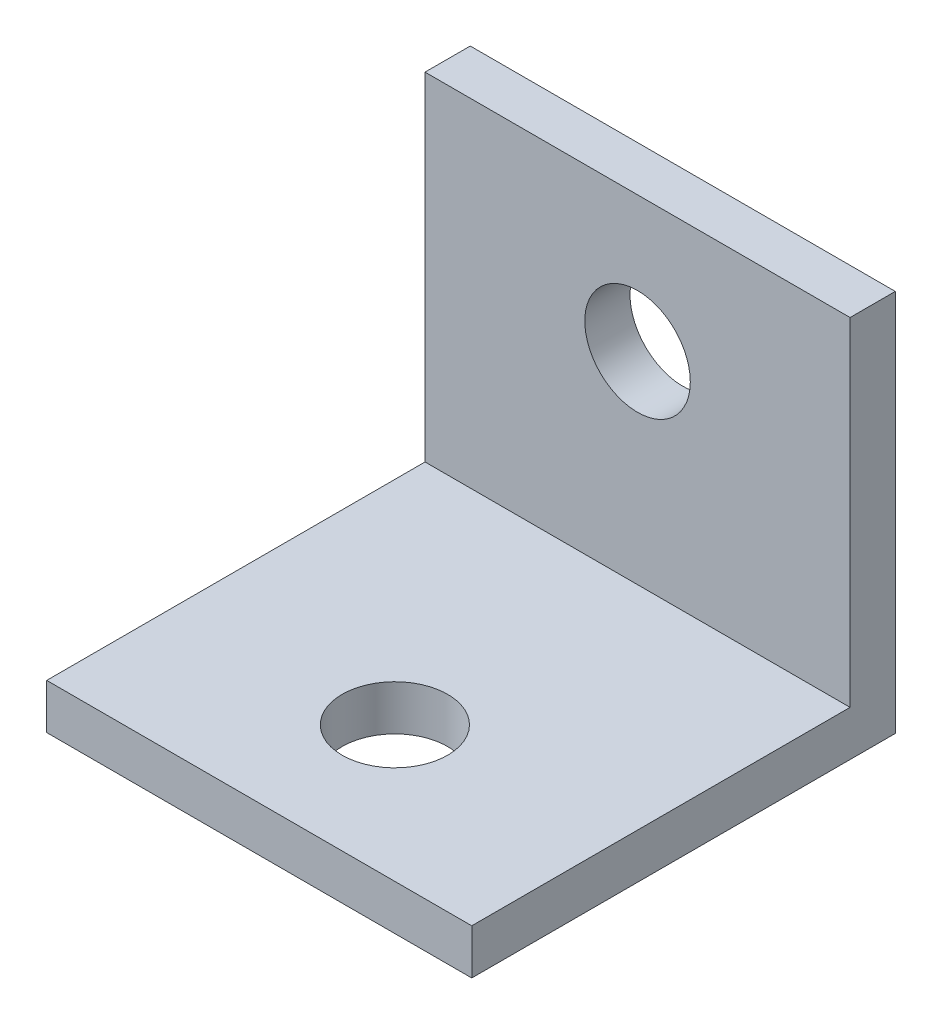
ISO-10303-21;
HEADER;
FILE_DESCRIPTION(('STEP AP214'),'2;1');
FILE_NAME('part.step','',(''),(''),'','','');
FILE_SCHEMA(('AUTOMOTIVE_DESIGN { 1 0 10303 214 1 1 1 1 }'));
ENDSEC;
DATA;
#1=APPLICATION_CONTEXT('core data for automotive mechanical design processes');
#2=APPLICATION_PROTOCOL_DEFINITION('international standard','automotive_design',2000,#1);
#3=PRODUCT_CONTEXT('',#1,'mechanical');
#4=PRODUCT('Part','Part','',(#3));
#5=PRODUCT_RELATED_PRODUCT_CATEGORY('part','',(#4));
#6=PRODUCT_DEFINITION_FORMATION('','',#4);
#7=PRODUCT_DEFINITION_CONTEXT('part definition',#1,'design');
#8=PRODUCT_DEFINITION('design','',#6,#7);
#9=PRODUCT_DEFINITION_SHAPE('','',#8);
#10=(LENGTH_UNIT() NAMED_UNIT(*) SI_UNIT(.MILLI.,.METRE.));
#11=(NAMED_UNIT(*) PLANE_ANGLE_UNIT() SI_UNIT($,.RADIAN.));
#12=(NAMED_UNIT(*) SI_UNIT($,.STERADIAN.) SOLID_ANGLE_UNIT());
#13=UNCERTAINTY_MEASURE_WITH_UNIT(LENGTH_MEASURE(1.E-05),#10,'distance_accuracy_value','');
#14=(GEOMETRIC_REPRESENTATION_CONTEXT(3) GLOBAL_UNCERTAINTY_ASSIGNED_CONTEXT((#13)) GLOBAL_UNIT_ASSIGNED_CONTEXT((#10,
#11,#12)) REPRESENTATION_CONTEXT('',''));
#15=CARTESIAN_POINT('',(0.,0.,0.));
#16=DIRECTION('',(0.,0.,1.));
#17=DIRECTION('',(1.,0.,0.));
#18=AXIS2_PLACEMENT_3D('',#15,#16,#17);
#19=CARTESIAN_POINT('',(-28.2,16.1822580645161,3.));
#20=DIRECTION('',(1.,0.,0.));
#21=DIRECTION('',(0.,1.,0.));
#22=AXIS2_PLACEMENT_3D('',#19,#20,#21);
#23=PLANE('',#22);
#24=DIRECTION('',(0.,-1.,0.));
#25=VECTOR('',#24,1.);
#26=CARTESIAN_POINT('',(-28.2,16.1822580645161,0.));
#27=LINE('',#26,#25);
#28=CARTESIAN_POINT('',(-28.2,16.1822580645161,0.));
#29=VERTEX_POINT('',#28);
#30=CARTESIAN_POINT('',(-28.2,-9.21774193548386,0.));
#31=VERTEX_POINT('',#30);
#32=EDGE_CURVE('E92',#29,#31,#27,.T.);
#33=ORIENTED_EDGE('',*,*,#32,.T.);
#34=DIRECTION('',(0.,0.,-1.));
#35=VECTOR('',#34,1.);
#36=CARTESIAN_POINT('',(-28.2,-9.21774193548386,3.));
#37=LINE('',#36,#35);
#38=CARTESIAN_POINT('',(-28.2,-9.21774193548386,28.1));
#39=VERTEX_POINT('',#38);
#40=EDGE_CURVE('E11',#39,#31,#37,.T.);
#41=ORIENTED_EDGE('',*,*,#40,.F.);
#42=DIRECTION('',(0.,-1.,0.));
#43=VECTOR('',#42,1.);
#44=CARTESIAN_POINT('',(-28.2,-9.21774193548386,28.1));
#45=LINE('',#44,#43);
#46=CARTESIAN_POINT('',(-28.2,-6.21774193548386,28.1));
#47=VERTEX_POINT('',#46);
#48=EDGE_CURVE('E129',#47,#39,#45,.T.);
#49=ORIENTED_EDGE('',*,*,#48,.F.);
#50=DIRECTION('',(0.,0.,-1.));
#51=VECTOR('',#50,1.);
#52=CARTESIAN_POINT('',(-28.2,-6.21774193548386,28.1));
#53=LINE('',#52,#51);
#54=CARTESIAN_POINT('',(-28.2,-6.21774193548386,3.));
#55=VERTEX_POINT('',#54);
#56=EDGE_CURVE('E101',#47,#55,#53,.T.);
#57=ORIENTED_EDGE('',*,*,#56,.T.);
#58=DIRECTION('',(0.,-1.,0.));
#59=VECTOR('',#58,1.);
#60=CARTESIAN_POINT('',(-28.2,16.1822580645161,3.));
#61=LINE('',#60,#59);
#62=CARTESIAN_POINT('',(-28.2,16.1822580645161,3.));
#63=VERTEX_POINT('',#62);
#64=EDGE_CURVE('E86',#63,#55,#61,.T.);
#65=ORIENTED_EDGE('',*,*,#64,.F.);
#66=DIRECTION('',(0.,0.,-1.));
#67=VECTOR('',#66,1.);
#68=CARTESIAN_POINT('',(-28.2,16.1822580645161,3.));
#69=LINE('',#68,#67);
#70=EDGE_CURVE('E79',#63,#29,#69,.T.);
#71=ORIENTED_EDGE('',*,*,#70,.T.);
#72=EDGE_LOOP('',(#33,#41,#49,#57,#65,#71));
#73=FACE_BOUND('',#72,.T.);
#74=ADVANCED_FACE('F37',(#73),#23,.F.);
#75=CARTESIAN_POINT('',(-28.2,-9.21774193548386,3.));
#76=DIRECTION('',(0.,1.,0.));
#77=DIRECTION('',(-1.,0.,0.));
#78=AXIS2_PLACEMENT_3D('',#75,#76,#77);
#79=PLANE('',#78);
#80=CARTESIAN_POINT('',(-14.1,-9.21774193548386,19.1));
#81=DIRECTION('',(0.,1.,0.));
#82=DIRECTION('',(0.,0.,1.));
#83=AXIS2_PLACEMENT_3D('',#80,#81,#82);
#84=CIRCLE('',#83,3.5);
#85=CARTESIAN_POINT('',(-14.1,-9.21774193548386,22.6));
#86=VERTEX_POINT('',#85);
#87=EDGE_CURVE('E138',#86,#86,#84,.T.);
#88=ORIENTED_EDGE('',*,*,#87,.T.);
#89=EDGE_LOOP('',(#88));
#90=FACE_BOUND('',#89,.T.);
#91=DIRECTION('',(1.,0.,0.));
#92=VECTOR('',#91,1.);
#93=CARTESIAN_POINT('',(-28.2,-9.21774193548386,0.));
#94=LINE('',#93,#92);
#95=CARTESIAN_POINT('',(0.,-9.21774193548386,0.));
#96=VERTEX_POINT('',#95);
#97=EDGE_CURVE('E96',#31,#96,#94,.T.);
#98=ORIENTED_EDGE('',*,*,#97,.T.);
#99=DIRECTION('',(0.,0.,-1.));
#100=VECTOR('',#99,1.);
#101=CARTESIAN_POINT('',(0.,-9.21774193548386,3.));
#102=LINE('',#101,#100);
#103=CARTESIAN_POINT('',(0.,-9.21774193548386,28.1));
#104=VERTEX_POINT('',#103);
#105=EDGE_CURVE('E44',#104,#96,#102,.T.);
#106=ORIENTED_EDGE('',*,*,#105,.F.);
#107=DIRECTION('',(1.,0.,0.));
#108=VECTOR('',#107,1.);
#109=CARTESIAN_POINT('',(-28.2,-9.21774193548386,28.1));
#110=LINE('',#109,#108);
#111=EDGE_CURVE('E121',#39,#104,#110,.T.);
#112=ORIENTED_EDGE('',*,*,#111,.F.);
#113=ORIENTED_EDGE('',*,*,#40,.T.);
#114=EDGE_LOOP('',(#98,#106,#112,#113));
#115=FACE_BOUND('',#114,.T.);
#116=ADVANCED_FACE('F119',(#90,#115),#79,.F.);
#117=CARTESIAN_POINT('',(0.,16.1822580645161,3.));
#118=DIRECTION('',(-1.,0.,0.));
#119=DIRECTION('',(0.,0.,1.));
#120=AXIS2_PLACEMENT_3D('',#117,#118,#119);
#121=PLANE('',#120);
#122=DIRECTION('',(0.,1.,0.));
#123=VECTOR('',#122,1.);
#124=CARTESIAN_POINT('',(0.,16.1822580645161,0.));
#125=LINE('',#124,#123);
#126=CARTESIAN_POINT('',(0.,16.1822580645161,0.));
#127=VERTEX_POINT('',#126);
#128=EDGE_CURVE('E87',#96,#127,#125,.T.);
#129=ORIENTED_EDGE('',*,*,#128,.T.);
#130=DIRECTION('',(0.,0.,-1.));
#131=VECTOR('',#130,1.);
#132=CARTESIAN_POINT('',(0.,16.1822580645161,3.));
#133=LINE('',#132,#131);
#134=CARTESIAN_POINT('',(0.,16.1822580645161,3.));
#135=VERTEX_POINT('',#134);
#136=EDGE_CURVE('E82',#135,#127,#133,.T.);
#137=ORIENTED_EDGE('',*,*,#136,.F.);
#138=DIRECTION('',(0.,1.,0.));
#139=VECTOR('',#138,1.);
#140=CARTESIAN_POINT('',(0.,16.1822580645161,3.));
#141=LINE('',#140,#139);
#142=CARTESIAN_POINT('',(0.,-6.21774193548386,3.));
#143=VERTEX_POINT('',#142);
#144=EDGE_CURVE('E140',#143,#135,#141,.T.);
#145=ORIENTED_EDGE('',*,*,#144,.F.);
#146=DIRECTION('',(0.,0.,-1.));
#147=VECTOR('',#146,1.);
#148=CARTESIAN_POINT('',(0.,-6.21774193548386,28.1));
#149=LINE('',#148,#147);
#150=CARTESIAN_POINT('',(0.,-6.21774193548386,28.1));
#151=VERTEX_POINT('',#150);
#152=EDGE_CURVE('E97',#151,#143,#149,.T.);
#153=ORIENTED_EDGE('',*,*,#152,.F.);
#154=DIRECTION('',(0.,1.,0.));
#155=VECTOR('',#154,1.);
#156=CARTESIAN_POINT('',(0.,-9.21774193548386,28.1));
#157=LINE('',#156,#155);
#158=EDGE_CURVE('E115',#104,#151,#157,.T.);
#159=ORIENTED_EDGE('',*,*,#158,.F.);
#160=ORIENTED_EDGE('',*,*,#105,.T.);
#161=EDGE_LOOP('',(#129,#137,#145,#153,#159,#160));
#162=FACE_BOUND('',#161,.T.);
#163=ADVANCED_FACE('F111',(#162),#121,.F.);
#164=CARTESIAN_POINT('',(-28.2,16.1822580645161,3.));
#165=DIRECTION('',(0.,-1.,0.));
#166=DIRECTION('',(0.,0.,-1.));
#167=AXIS2_PLACEMENT_3D('',#164,#165,#166);
#168=PLANE('',#167);
#169=DIRECTION('',(-1.,0.,0.));
#170=VECTOR('',#169,1.);
#171=CARTESIAN_POINT('',(-28.2,16.1822580645161,0.));
#172=LINE('',#171,#170);
#173=EDGE_CURVE('E76',#127,#29,#172,.T.);
#174=ORIENTED_EDGE('',*,*,#173,.T.);
#175=ORIENTED_EDGE('',*,*,#70,.F.);
#176=DIRECTION('',(-1.,0.,0.));
#177=VECTOR('',#176,1.);
#178=CARTESIAN_POINT('',(-28.2,16.1822580645161,3.));
#179=LINE('',#178,#177);
#180=EDGE_CURVE('E57',#135,#63,#179,.T.);
#181=ORIENTED_EDGE('',*,*,#180,.F.);
#182=ORIENTED_EDGE('',*,*,#136,.T.);
#183=EDGE_LOOP('',(#174,#175,#181,#182));
#184=FACE_BOUND('',#183,.T.);
#185=ADVANCED_FACE('F78',(#184),#168,.F.);
#186=CARTESIAN_POINT('',(0.,0.,3.));
#187=DIRECTION('',(0.,0.,1.));
#188=DIRECTION('',(1.,0.,0.));
#189=AXIS2_PLACEMENT_3D('',#186,#187,#188);
#190=PLANE('',#189);
#191=CARTESIAN_POINT('',(-14.1,7.18225806451613,3.));
#192=DIRECTION('',(0.,0.,1.));
#193=DIRECTION('',(1.,0.,0.));
#194=AXIS2_PLACEMENT_3D('',#191,#192,#193);
#195=CIRCLE('',#194,3.5);
#196=CARTESIAN_POINT('',(-10.6,7.18225806451613,3.));
#197=VERTEX_POINT('',#196);
#198=EDGE_CURVE('E181',#197,#197,#195,.T.);
#199=ORIENTED_EDGE('',*,*,#198,.F.);
#200=EDGE_LOOP('',(#199));
#201=FACE_BOUND('',#200,.T.);
#202=DIRECTION('',(-1.,0.,0.));
#203=VECTOR('',#202,1.);
#204=CARTESIAN_POINT('',(-28.2,-6.21774193548386,3.));
#205=LINE('',#204,#203);
#206=EDGE_CURVE('E51',#143,#55,#205,.T.);
#207=ORIENTED_EDGE('',*,*,#206,.F.);
#208=ORIENTED_EDGE('',*,*,#144,.T.);
#209=ORIENTED_EDGE('',*,*,#180,.T.);
#210=ORIENTED_EDGE('',*,*,#64,.T.);
#211=EDGE_LOOP('',(#207,#208,#209,#210));
#212=FACE_BOUND('',#211,.T.);
#213=ADVANCED_FACE('F141',(#201,#212),#190,.T.);
#214=CARTESIAN_POINT('',(0.,0.,0.));
#215=DIRECTION('',(0.,0.,1.));
#216=DIRECTION('',(1.,0.,0.));
#217=AXIS2_PLACEMENT_3D('',#214,#215,#216);
#218=PLANE('',#217);
#219=CARTESIAN_POINT('',(-14.1,7.18225806451613,0.));
#220=DIRECTION('',(0.,0.,1.));
#221=DIRECTION('',(1.,0.,0.));
#222=AXIS2_PLACEMENT_3D('',#219,#220,#221);
#223=CIRCLE('',#222,3.5);
#224=CARTESIAN_POINT('',(-10.6,7.18225806451613,0.));
#225=VERTEX_POINT('',#224);
#226=EDGE_CURVE('E183',#225,#225,#223,.T.);
#227=ORIENTED_EDGE('',*,*,#226,.T.);
#228=EDGE_LOOP('',(#227));
#229=FACE_BOUND('',#228,.T.);
#230=ORIENTED_EDGE('',*,*,#32,.F.);
#231=ORIENTED_EDGE('',*,*,#173,.F.);
#232=ORIENTED_EDGE('',*,*,#128,.F.);
#233=ORIENTED_EDGE('',*,*,#97,.F.);
#234=EDGE_LOOP('',(#230,#231,#232,#233));
#235=FACE_BOUND('',#234,.T.);
#236=ADVANCED_FACE('F95',(#229,#235),#218,.F.);
#237=CARTESIAN_POINT('',(-28.2,-6.21774193548386,28.1));
#238=DIRECTION('',(0.,-1.,0.));
#239=DIRECTION('',(0.,0.,-1.));
#240=AXIS2_PLACEMENT_3D('',#237,#238,#239);
#241=PLANE('',#240);
#242=CARTESIAN_POINT('',(-14.1,-6.21774193548386,19.1));
#243=DIRECTION('',(0.,1.,0.));
#244=DIRECTION('',(0.,0.,1.));
#245=AXIS2_PLACEMENT_3D('',#242,#243,#244);
#246=CIRCLE('',#245,3.5);
#247=CARTESIAN_POINT('',(-14.1,-6.21774193548386,22.6));
#248=VERTEX_POINT('',#247);
#249=EDGE_CURVE('E186',#248,#248,#246,.T.);
#250=ORIENTED_EDGE('',*,*,#249,.F.);
#251=EDGE_LOOP('',(#250));
#252=FACE_BOUND('',#251,.T.);
#253=ORIENTED_EDGE('',*,*,#206,.T.);
#254=ORIENTED_EDGE('',*,*,#56,.F.);
#255=DIRECTION('',(-1.,0.,0.));
#256=VECTOR('',#255,1.);
#257=CARTESIAN_POINT('',(-28.2,-6.21774193548386,28.1));
#258=LINE('',#257,#256);
#259=EDGE_CURVE('E131',#151,#47,#258,.T.);
#260=ORIENTED_EDGE('',*,*,#259,.F.);
#261=ORIENTED_EDGE('',*,*,#152,.T.);
#262=EDGE_LOOP('',(#253,#254,#260,#261));
#263=FACE_BOUND('',#262,.T.);
#264=ADVANCED_FACE('F144',(#252,#263),#241,.F.);
#265=CARTESIAN_POINT('',(0.,0.,28.1));
#266=DIRECTION('',(0.,0.,-1.));
#267=DIRECTION('',(-1.,0.,0.));
#268=AXIS2_PLACEMENT_3D('',#265,#266,#267);
#269=PLANE('',#268);
#270=ORIENTED_EDGE('',*,*,#48,.T.);
#271=ORIENTED_EDGE('',*,*,#111,.T.);
#272=ORIENTED_EDGE('',*,*,#158,.T.);
#273=ORIENTED_EDGE('',*,*,#259,.T.);
#274=EDGE_LOOP('',(#270,#271,#272,#273));
#275=FACE_BOUND('',#274,.T.);
#276=ADVANCED_FACE('F126',(#275),#269,.F.);
#277=CARTESIAN_POINT('',(-14.1,-9.21774193548386,19.1));
#278=DIRECTION('',(0.,1.,0.));
#279=DIRECTION('',(0.,0.,1.));
#280=AXIS2_PLACEMENT_3D('',#277,#278,#279);
#281=CYLINDRICAL_SURFACE('',#280,3.5);
#282=ORIENTED_EDGE('',*,*,#87,.F.);
#283=EDGE_LOOP('',(#282));
#284=FACE_BOUND('',#283,.T.);
#285=ORIENTED_EDGE('',*,*,#249,.T.);
#286=EDGE_LOOP('',(#285));
#287=FACE_BOUND('',#286,.T.);
#288=ADVANCED_FACE('F157',(#284,#287),#281,.F.);
#289=CARTESIAN_POINT('',(-14.1,7.18225806451613,0.));
#290=DIRECTION('',(0.,0.,1.));
#291=DIRECTION('',(1.,0.,0.));
#292=AXIS2_PLACEMENT_3D('',#289,#290,#291);
#293=CYLINDRICAL_SURFACE('',#292,3.5);
#294=ORIENTED_EDGE('',*,*,#226,.F.);
#295=EDGE_LOOP('',(#294));
#296=FACE_BOUND('',#295,.T.);
#297=ORIENTED_EDGE('',*,*,#198,.T.);
#298=EDGE_LOOP('',(#297));
#299=FACE_BOUND('',#298,.T.);
#300=ADVANCED_FACE('F192',(#296,#299),#293,.F.);
#301=CLOSED_SHELL('',(#74,#116,#163,#185,#213,#236,#264,#276,#288,#300));
#302=MANIFOLD_SOLID_BREP('B2',#301);
#303=ADVANCED_BREP_SHAPE_REPRESENTATION('',(#18,#302),#14);
#304=SHAPE_DEFINITION_REPRESENTATION(#9,#303);
ENDSEC;
END-ISO-10303-21;
